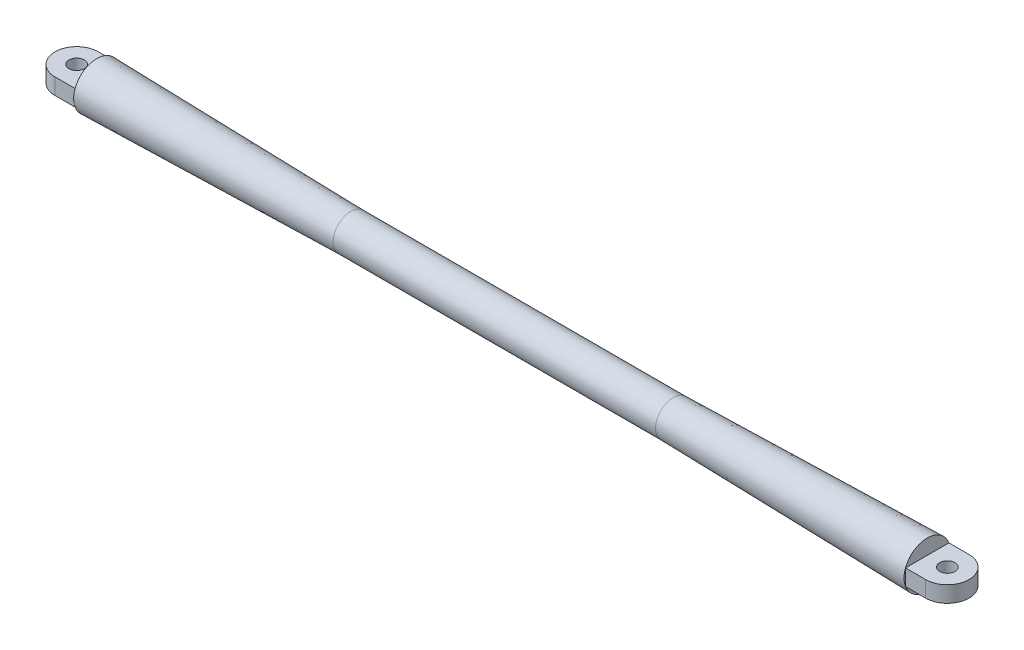
ISO-10303-21;
HEADER;
FILE_DESCRIPTION(('STEP AP214'),'2;1');
FILE_NAME('part.step','',(''),(''),'','','');
FILE_SCHEMA(('AUTOMOTIVE_DESIGN { 1 0 10303 214 1 1 1 1 }'));
ENDSEC;
DATA;
#1=APPLICATION_CONTEXT('core data for automotive mechanical design processes');
#2=APPLICATION_PROTOCOL_DEFINITION('international standard','automotive_design',2000,#1);
#3=PRODUCT_CONTEXT('',#1,'mechanical');
#4=PRODUCT('Part','Part','',(#3));
#5=PRODUCT_RELATED_PRODUCT_CATEGORY('part','',(#4));
#6=PRODUCT_DEFINITION_FORMATION('','',#4);
#7=PRODUCT_DEFINITION_CONTEXT('part definition',#1,'design');
#8=PRODUCT_DEFINITION('design','',#6,#7);
#9=PRODUCT_DEFINITION_SHAPE('','',#8);
#10=(LENGTH_UNIT() NAMED_UNIT(*) SI_UNIT(.MILLI.,.METRE.));
#11=(NAMED_UNIT(*) PLANE_ANGLE_UNIT() SI_UNIT($,.RADIAN.));
#12=(NAMED_UNIT(*) SI_UNIT($,.STERADIAN.) SOLID_ANGLE_UNIT());
#13=UNCERTAINTY_MEASURE_WITH_UNIT(LENGTH_MEASURE(1.E-05),#10,'distance_accuracy_value','');
#14=(GEOMETRIC_REPRESENTATION_CONTEXT(3) GLOBAL_UNCERTAINTY_ASSIGNED_CONTEXT((#13)) GLOBAL_UNIT_ASSIGNED_CONTEXT((#10,
#11,#12)) REPRESENTATION_CONTEXT('',''));
#15=CARTESIAN_POINT('',(0.,0.,0.));
#16=DIRECTION('',(0.,0.,1.));
#17=DIRECTION('',(1.,0.,0.));
#18=AXIS2_PLACEMENT_3D('',#15,#16,#17);
#19=CARTESIAN_POINT('',(575.,0.,0.));
#20=DIRECTION('',(1.,0.,0.));
#21=DIRECTION('',(0.,0.,-1.));
#22=AXIS2_PLACEMENT_3D('',#19,#20,#21);
#23=CONICAL_SURFACE('',#22,30.,0.0213300978711052);
#24=CARTESIAN_POINT('',(200.,0.,0.));
#25=DIRECTION('',(-1.,0.,0.));
#26=DIRECTION('',(0.,0.,1.));
#27=AXIS2_PLACEMENT_3D('',#24,#25,#26);
#28=CIRCLE('',#27,22.);
#29=CARTESIAN_POINT('',(200.,0.,22.));
#30=VERTEX_POINT('',#29);
#31=EDGE_CURVE('E185',#30,#30,#28,.T.);
#32=ORIENTED_EDGE('',*,*,#31,.F.);
#33=EDGE_LOOP('',(#32));
#34=FACE_BOUND('',#33,.T.);
#35=CARTESIAN_POINT('',(515.,0.,0.));
#36=DIRECTION('',(-1.,0.,0.));
#37=DIRECTION('',(0.,-1.,0.));
#38=AXIS2_PLACEMENT_3D('',#35,#36,#37);
#39=CIRCLE('',#38,28.72);
#40=CARTESIAN_POINT('',(515.,10.,26.9228230317699));
#41=VERTEX_POINT('',#40);
#42=CARTESIAN_POINT('',(515.,10.,-26.9228230317699));
#43=VERTEX_POINT('',#42);
#44=EDGE_CURVE('E193',#41,#43,#39,.T.);
#45=ORIENTED_EDGE('',*,*,#44,.T.);
#46=CARTESIAN_POINT('',(515.,0.,0.));
#47=DIRECTION('',(-1.,0.,0.));
#48=DIRECTION('',(0.,-1.,0.));
#49=AXIS2_PLACEMENT_3D('',#46,#47,#48);
#50=CIRCLE('',#49,28.72);
#51=CARTESIAN_POINT('',(515.,-10.,-26.9228230317699));
#52=VERTEX_POINT('',#51);
#53=EDGE_CURVE('E178',#43,#52,#50,.T.);
#54=ORIENTED_EDGE('',*,*,#53,.T.);
#55=CARTESIAN_POINT('',(515.,3.92669099316312E-13,0.));
#56=DIRECTION('',(-1.,0.,0.));
#57=DIRECTION('',(0.,-1.,0.));
#58=AXIS2_PLACEMENT_3D('',#55,#56,#57);
#59=CIRCLE('',#58,28.72);
#60=CARTESIAN_POINT('',(515.,-10.,26.9228230317699));
#61=VERTEX_POINT('',#60);
#62=EDGE_CURVE('E190',#52,#61,#59,.T.);
#63=ORIENTED_EDGE('',*,*,#62,.T.);
#64=CARTESIAN_POINT('',(515.,0.,0.));
#65=DIRECTION('',(-1.,0.,0.));
#66=DIRECTION('',(0.,-1.,0.));
#67=AXIS2_PLACEMENT_3D('',#64,#65,#66);
#68=CIRCLE('',#67,28.72);
#69=EDGE_CURVE('E175',#61,#41,#68,.T.);
#70=ORIENTED_EDGE('',*,*,#69,.T.);
#71=EDGE_LOOP('',(#45,#54,#63,#70));
#72=FACE_BOUND('',#71,.T.);
#73=ADVANCED_FACE('F33',(#34,#72),#23,.T.);
#74=CARTESIAN_POINT('',(0.,0.,0.));
#75=DIRECTION('',(-1.,0.,0.));
#76=DIRECTION('',(0.,0.,1.));
#77=AXIS2_PLACEMENT_3D('',#74,#75,#76);
#78=CYLINDRICAL_SURFACE('',#77,22.);
#79=ORIENTED_EDGE('',*,*,#31,.T.);
#80=EDGE_LOOP('',(#79));
#81=FACE_BOUND('',#80,.T.);
#82=CARTESIAN_POINT('',(-200.,0.,0.));
#83=DIRECTION('',(-1.,0.,0.));
#84=DIRECTION('',(0.,0.,1.));
#85=AXIS2_PLACEMENT_3D('',#82,#83,#84);
#86=CIRCLE('',#85,22.);
#87=CARTESIAN_POINT('',(-200.,0.,22.));
#88=VERTEX_POINT('',#87);
#89=EDGE_CURVE('E136',#88,#88,#86,.T.);
#90=ORIENTED_EDGE('',*,*,#89,.F.);
#91=EDGE_LOOP('',(#90));
#92=FACE_BOUND('',#91,.T.);
#93=ADVANCED_FACE('F231',(#81,#92),#78,.T.);
#94=CARTESIAN_POINT('',(515.,-43.7552756099469,-30.));
#95=DIRECTION('',(-1.,0.,0.));
#96=DIRECTION('',(0.,-1.,0.));
#97=AXIS2_PLACEMENT_3D('',#94,#95,#96);
#98=PLANE('',#97);
#99=DIRECTION('',(0.,0.,1.));
#100=VECTOR('',#99,1.);
#101=CARTESIAN_POINT('',(515.,-10.,-30.));
#102=LINE('',#101,#100);
#103=EDGE_CURVE('E181',#52,#61,#102,.T.);
#104=ORIENTED_EDGE('',*,*,#103,.T.);
#105=ORIENTED_EDGE('',*,*,#62,.F.);
#106=EDGE_LOOP('',(#104,#105));
#107=FACE_BOUND('',#106,.T.);
#108=ADVANCED_FACE('F212',(#107),#98,.F.);
#109=CARTESIAN_POINT('',(515.,-10.,-30.));
#110=DIRECTION('',(0.,1.,0.));
#111=DIRECTION('',(-1.,0.,0.));
#112=AXIS2_PLACEMENT_3D('',#109,#110,#111);
#113=PLANE('',#112);
#114=CARTESIAN_POINT('',(540.,-10.,0.));
#115=DIRECTION('',(0.,1.,0.));
#116=DIRECTION('',(-1.,0.,0.));
#117=AXIS2_PLACEMENT_3D('',#114,#115,#116);
#118=CIRCLE('',#117,9.49999999999995);
#119=CARTESIAN_POINT('',(530.5,-10.,0.));
#120=VERTEX_POINT('',#119);
#121=EDGE_CURVE('E155',#120,#120,#118,.T.);
#122=ORIENTED_EDGE('',*,*,#121,.T.);
#123=EDGE_LOOP('',(#122));
#124=FACE_BOUND('',#123,.T.);
#125=CARTESIAN_POINT('',(540.,-10.,0.));
#126=DIRECTION('',(0.,1.,0.));
#127=DIRECTION('',(-1.,0.,0.));
#128=AXIS2_PLACEMENT_3D('',#125,#126,#127);
#129=CIRCLE('',#128,26.9228230317699);
#130=CARTESIAN_POINT('',(540.,-10.,-26.9228230317699));
#131=VERTEX_POINT('',#130);
#132=CARTESIAN_POINT('',(540.,-10.,26.9228230317699));
#133=VERTEX_POINT('',#132);
#134=EDGE_CURVE('E169',#131,#133,#129,.F.);
#135=ORIENTED_EDGE('',*,*,#134,.T.);
#136=DIRECTION('',(-1.,0.,0.));
#137=VECTOR('',#136,1.);
#138=CARTESIAN_POINT('',(515.,-10.,26.9228230317699));
#139=LINE('',#138,#137);
#140=EDGE_CURVE('E172',#133,#61,#139,.T.);
#141=ORIENTED_EDGE('',*,*,#140,.T.);
#142=ORIENTED_EDGE('',*,*,#103,.F.);
#143=DIRECTION('',(1.,0.,0.));
#144=VECTOR('',#143,1.);
#145=CARTESIAN_POINT('',(515.,-10.,-26.9228230317699));
#146=LINE('',#145,#144);
#147=EDGE_CURVE('E160',#52,#131,#146,.T.);
#148=ORIENTED_EDGE('',*,*,#147,.T.);
#149=EDGE_LOOP('',(#135,#141,#142,#148));
#150=FACE_BOUND('',#149,.T.);
#151=ADVANCED_FACE('F209',(#124,#150),#113,.F.);
#152=CARTESIAN_POINT('',(515.,43.7552756099469,-30.));
#153=DIRECTION('',(-1.,0.,0.));
#154=DIRECTION('',(0.,-1.,0.));
#155=AXIS2_PLACEMENT_3D('',#152,#153,#154);
#156=PLANE('',#155);
#157=DIRECTION('',(0.,0.,1.));
#158=VECTOR('',#157,1.);
#159=CARTESIAN_POINT('',(515.,10.,-30.));
#160=LINE('',#159,#158);
#161=EDGE_CURVE('E182',#43,#41,#160,.T.);
#162=ORIENTED_EDGE('',*,*,#161,.F.);
#163=ORIENTED_EDGE('',*,*,#44,.F.);
#164=EDGE_LOOP('',(#162,#163));
#165=FACE_BOUND('',#164,.T.);
#166=ADVANCED_FACE('F226',(#165),#156,.F.);
#167=CARTESIAN_POINT('',(515.,10.,-30.));
#168=DIRECTION('',(0.,-1.,0.));
#169=DIRECTION('',(1.,0.,0.));
#170=AXIS2_PLACEMENT_3D('',#167,#168,#169);
#171=PLANE('',#170);
#172=CARTESIAN_POINT('',(540.,10.,0.));
#173=DIRECTION('',(0.,1.,0.));
#174=DIRECTION('',(-1.,0.,0.));
#175=AXIS2_PLACEMENT_3D('',#172,#173,#174);
#176=CIRCLE('',#175,9.49999999999995);
#177=CARTESIAN_POINT('',(530.5,10.,0.));
#178=VERTEX_POINT('',#177);
#179=EDGE_CURVE('E152',#178,#178,#176,.T.);
#180=ORIENTED_EDGE('',*,*,#179,.F.);
#181=EDGE_LOOP('',(#180));
#182=FACE_BOUND('',#181,.T.);
#183=ORIENTED_EDGE('',*,*,#161,.T.);
#184=DIRECTION('',(1.,0.,0.));
#185=VECTOR('',#184,1.);
#186=CARTESIAN_POINT('',(515.,10.,26.9228230317699));
#187=LINE('',#186,#185);
#188=CARTESIAN_POINT('',(540.,10.,26.9228230317699));
#189=VERTEX_POINT('',#188);
#190=EDGE_CURVE('E11',#41,#189,#187,.T.);
#191=ORIENTED_EDGE('',*,*,#190,.T.);
#192=CARTESIAN_POINT('',(540.,10.,0.));
#193=DIRECTION('',(0.,-1.,0.));
#194=DIRECTION('',(1.,0.,0.));
#195=AXIS2_PLACEMENT_3D('',#192,#193,#194);
#196=CIRCLE('',#195,26.9228230317699);
#197=CARTESIAN_POINT('',(540.,10.,-26.9228230317699));
#198=VERTEX_POINT('',#197);
#199=EDGE_CURVE('E40',#189,#198,#196,.F.);
#200=ORIENTED_EDGE('',*,*,#199,.T.);
#201=DIRECTION('',(-1.,0.,0.));
#202=VECTOR('',#201,1.);
#203=CARTESIAN_POINT('',(515.,10.,-26.9228230317699));
#204=LINE('',#203,#202);
#205=EDGE_CURVE('E196',#198,#43,#204,.T.);
#206=ORIENTED_EDGE('',*,*,#205,.T.);
#207=EDGE_LOOP('',(#183,#191,#200,#206));
#208=FACE_BOUND('',#207,.T.);
#209=ADVANCED_FACE('F200',(#182,#208),#171,.F.);
#210=CARTESIAN_POINT('',(515.,-28.7199999999996,-26.9228230317699));
#211=DIRECTION('',(-1.,0.,0.));
#212=DIRECTION('',(0.,-1.,0.));
#213=AXIS2_PLACEMENT_3D('',#210,#211,#212);
#214=PLANE('',#213);
#215=DIRECTION('',(0.,1.,0.));
#216=VECTOR('',#215,1.);
#217=CARTESIAN_POINT('',(515.,-28.7199999999996,-26.9228230317699));
#218=LINE('',#217,#216);
#219=EDGE_CURVE('E47',#52,#43,#218,.T.);
#220=ORIENTED_EDGE('',*,*,#219,.F.);
#221=ORIENTED_EDGE('',*,*,#53,.F.);
#222=EDGE_LOOP('',(#220,#221));
#223=FACE_BOUND('',#222,.T.);
#224=ADVANCED_FACE('F216',(#223),#214,.F.);
#225=CARTESIAN_POINT('',(515.,-28.7199999999996,47.4225049257848));
#226=DIRECTION('',(-1.,0.,0.));
#227=DIRECTION('',(0.,-1.,0.));
#228=AXIS2_PLACEMENT_3D('',#225,#226,#227);
#229=PLANE('',#228);
#230=DIRECTION('',(0.,1.,0.));
#231=VECTOR('',#230,1.);
#232=CARTESIAN_POINT('',(515.,-28.7199999999996,26.9228230317699));
#233=LINE('',#232,#231);
#234=EDGE_CURVE('E158',#61,#41,#233,.T.);
#235=ORIENTED_EDGE('',*,*,#234,.T.);
#236=ORIENTED_EDGE('',*,*,#69,.F.);
#237=EDGE_LOOP('',(#235,#236));
#238=FACE_BOUND('',#237,.T.);
#239=ADVANCED_FACE('F218',(#238),#229,.F.);
#240=CARTESIAN_POINT('',(540.,-28.7199999999996,26.9228230317699));
#241=DIRECTION('',(0.,0.,-1.));
#242=DIRECTION('',(-1.,0.,0.));
#243=AXIS2_PLACEMENT_3D('',#240,#241,#242);
#244=PLANE('',#243);
#245=DIRECTION('',(0.,1.,0.));
#246=VECTOR('',#245,1.);
#247=CARTESIAN_POINT('',(540.,-28.7199999999996,26.9228230317699));
#248=LINE('',#247,#246);
#249=EDGE_CURVE('E161',#133,#189,#248,.T.);
#250=ORIENTED_EDGE('',*,*,#249,.T.);
#251=ORIENTED_EDGE('',*,*,#190,.F.);
#252=ORIENTED_EDGE('',*,*,#234,.F.);
#253=ORIENTED_EDGE('',*,*,#140,.F.);
#254=EDGE_LOOP('',(#250,#251,#252,#253));
#255=FACE_BOUND('',#254,.T.);
#256=ADVANCED_FACE('F206',(#255),#244,.F.);
#257=CARTESIAN_POINT('',(540.,-28.7199999999996,0.));
#258=DIRECTION('',(0.,1.,0.));
#259=DIRECTION('',(-1.,0.,0.));
#260=AXIS2_PLACEMENT_3D('',#257,#258,#259);
#261=CYLINDRICAL_SURFACE('',#260,26.9228230317699);
#262=DIRECTION('',(0.,1.,0.));
#263=VECTOR('',#262,1.);
#264=CARTESIAN_POINT('',(540.,-28.7199999999996,-26.9228230317699));
#265=LINE('',#264,#263);
#266=EDGE_CURVE('E163',#131,#198,#265,.T.);
#267=ORIENTED_EDGE('',*,*,#266,.T.);
#268=ORIENTED_EDGE('',*,*,#199,.F.);
#269=ORIENTED_EDGE('',*,*,#249,.F.);
#270=ORIENTED_EDGE('',*,*,#134,.F.);
#271=EDGE_LOOP('',(#267,#268,#269,#270));
#272=FACE_BOUND('',#271,.T.);
#273=ADVANCED_FACE('F204',(#272),#261,.T.);
#274=CARTESIAN_POINT('',(515.,-28.7199999999996,-26.9228230317699));
#275=DIRECTION('',(0.,0.,1.));
#276=DIRECTION('',(1.,0.,0.));
#277=AXIS2_PLACEMENT_3D('',#274,#275,#276);
#278=PLANE('',#277);
#279=ORIENTED_EDGE('',*,*,#219,.T.);
#280=ORIENTED_EDGE('',*,*,#205,.F.);
#281=ORIENTED_EDGE('',*,*,#266,.F.);
#282=ORIENTED_EDGE('',*,*,#147,.F.);
#283=EDGE_LOOP('',(#279,#280,#281,#282));
#284=FACE_BOUND('',#283,.T.);
#285=ADVANCED_FACE('F273',(#284),#278,.F.);
#286=CARTESIAN_POINT('',(540.,-28.7199999999996,0.));
#287=DIRECTION('',(0.,1.,0.));
#288=DIRECTION('',(-1.,0.,0.));
#289=AXIS2_PLACEMENT_3D('',#286,#287,#288);
#290=CYLINDRICAL_SURFACE('',#289,9.49999999999995);
#291=ORIENTED_EDGE('',*,*,#179,.T.);
#292=EDGE_LOOP('',(#291));
#293=FACE_BOUND('',#292,.T.);
#294=ORIENTED_EDGE('',*,*,#121,.F.);
#295=EDGE_LOOP('',(#294));
#296=FACE_BOUND('',#295,.T.);
#297=ADVANCED_FACE('F245',(#293,#296),#290,.F.);
#298=CARTESIAN_POINT('',(-575.,0.,0.));
#299=DIRECTION('',(-1.,0.,0.));
#300=DIRECTION('',(0.,0.,-1.));
#301=AXIS2_PLACEMENT_3D('',#298,#299,#300);
#302=CONICAL_SURFACE('',#301,30.,0.0213300978711052);
#303=ORIENTED_EDGE('',*,*,#89,.T.);
#304=EDGE_LOOP('',(#303));
#305=FACE_BOUND('',#304,.T.);
#306=CARTESIAN_POINT('',(-515.,0.,0.));
#307=DIRECTION('',(-1.,0.,0.));
#308=DIRECTION('',(0.,-1.,0.));
#309=AXIS2_PLACEMENT_3D('',#306,#307,#308);
#310=CIRCLE('',#309,28.72);
#311=CARTESIAN_POINT('',(-515.,10.,26.9228230317699));
#312=VERTEX_POINT('',#311);
#313=CARTESIAN_POINT('',(-515.,10.,-26.9228230317699));
#314=VERTEX_POINT('',#313);
#315=EDGE_CURVE('E143',#312,#314,#310,.T.);
#316=ORIENTED_EDGE('',*,*,#315,.F.);
#317=CARTESIAN_POINT('',(-515.,0.,0.));
#318=DIRECTION('',(-1.,0.,0.));
#319=DIRECTION('',(0.,-1.,0.));
#320=AXIS2_PLACEMENT_3D('',#317,#318,#319);
#321=CIRCLE('',#320,28.72);
#322=CARTESIAN_POINT('',(-515.,-10.,26.9228230317699));
#323=VERTEX_POINT('',#322);
#324=EDGE_CURVE('E123',#323,#312,#321,.T.);
#325=ORIENTED_EDGE('',*,*,#324,.F.);
#326=CARTESIAN_POINT('',(-515.,3.92669099316312E-13,0.));
#327=DIRECTION('',(-1.,0.,0.));
#328=DIRECTION('',(0.,-1.,0.));
#329=AXIS2_PLACEMENT_3D('',#326,#327,#328);
#330=CIRCLE('',#329,28.72);
#331=CARTESIAN_POINT('',(-515.,-10.,-26.9228230317699));
#332=VERTEX_POINT('',#331);
#333=EDGE_CURVE('E140',#332,#323,#330,.T.);
#334=ORIENTED_EDGE('',*,*,#333,.F.);
#335=CARTESIAN_POINT('',(-515.,0.,0.));
#336=DIRECTION('',(-1.,0.,0.));
#337=DIRECTION('',(0.,-1.,0.));
#338=AXIS2_PLACEMENT_3D('',#335,#336,#337);
#339=CIRCLE('',#338,28.72);
#340=EDGE_CURVE('E129',#314,#332,#339,.T.);
#341=ORIENTED_EDGE('',*,*,#340,.F.);
#342=EDGE_LOOP('',(#316,#325,#334,#341));
#343=FACE_BOUND('',#342,.T.);
#344=ADVANCED_FACE('F241',(#305,#343),#302,.T.);
#345=CARTESIAN_POINT('',(-515.,-43.7552756099469,-30.));
#346=DIRECTION('',(1.,0.,0.));
#347=DIRECTION('',(0.,-1.,0.));
#348=AXIS2_PLACEMENT_3D('',#345,#346,#347);
#349=PLANE('',#348);
#350=DIRECTION('',(0.,0.,1.));
#351=VECTOR('',#350,1.);
#352=CARTESIAN_POINT('',(-515.,-10.,-30.));
#353=LINE('',#352,#351);
#354=EDGE_CURVE('E132',#332,#323,#353,.T.);
#355=ORIENTED_EDGE('',*,*,#354,.F.);
#356=ORIENTED_EDGE('',*,*,#333,.T.);
#357=EDGE_LOOP('',(#355,#356));
#358=FACE_BOUND('',#357,.T.);
#359=ADVANCED_FACE('F244',(#358),#349,.F.);
#360=CARTESIAN_POINT('',(-515.,-10.,-30.));
#361=DIRECTION('',(0.,1.,0.));
#362=DIRECTION('',(1.,0.,0.));
#363=AXIS2_PLACEMENT_3D('',#360,#361,#362);
#364=PLANE('',#363);
#365=CARTESIAN_POINT('',(-540.,-10.,0.));
#366=DIRECTION('',(0.,-1.,0.));
#367=DIRECTION('',(1.,0.,0.));
#368=AXIS2_PLACEMENT_3D('',#365,#366,#367);
#369=CIRCLE('',#368,9.49999999999995);
#370=CARTESIAN_POINT('',(-530.5,-10.,0.));
#371=VERTEX_POINT('',#370);
#372=EDGE_CURVE('E388',#371,#371,#369,.T.);
#373=ORIENTED_EDGE('',*,*,#372,.F.);
#374=EDGE_LOOP('',(#373));
#375=FACE_BOUND('',#374,.T.);
#376=CARTESIAN_POINT('',(-540.,-10.,0.));
#377=DIRECTION('',(0.,-1.,0.));
#378=DIRECTION('',(1.,0.,0.));
#379=AXIS2_PLACEMENT_3D('',#376,#377,#378);
#380=CIRCLE('',#379,26.9228230317699);
#381=CARTESIAN_POINT('',(-540.,-10.,-26.9228230317699));
#382=VERTEX_POINT('',#381);
#383=CARTESIAN_POINT('',(-540.,-10.,26.9228230317699));
#384=VERTEX_POINT('',#383);
#385=EDGE_CURVE('E101',#382,#384,#380,.F.);
#386=ORIENTED_EDGE('',*,*,#385,.F.);
#387=DIRECTION('',(-1.,0.,0.));
#388=VECTOR('',#387,1.);
#389=CARTESIAN_POINT('',(-515.,-10.,-26.9228230317699));
#390=LINE('',#389,#388);
#391=EDGE_CURVE('E111',#332,#382,#390,.T.);
#392=ORIENTED_EDGE('',*,*,#391,.F.);
#393=ORIENTED_EDGE('',*,*,#354,.T.);
#394=DIRECTION('',(1.,0.,0.));
#395=VECTOR('',#394,1.);
#396=CARTESIAN_POINT('',(-515.,-10.,26.9228230317699));
#397=LINE('',#396,#395);
#398=EDGE_CURVE('E121',#384,#323,#397,.T.);
#399=ORIENTED_EDGE('',*,*,#398,.F.);
#400=EDGE_LOOP('',(#386,#392,#393,#399));
#401=FACE_BOUND('',#400,.T.);
#402=ADVANCED_FACE('F119',(#375,#401),#364,.F.);
#403=CARTESIAN_POINT('',(-515.,43.7552756099469,-30.));
#404=DIRECTION('',(1.,0.,0.));
#405=DIRECTION('',(0.,-1.,0.));
#406=AXIS2_PLACEMENT_3D('',#403,#404,#405);
#407=PLANE('',#406);
#408=DIRECTION('',(0.,0.,1.));
#409=VECTOR('',#408,1.);
#410=CARTESIAN_POINT('',(-515.,10.,-30.));
#411=LINE('',#410,#409);
#412=EDGE_CURVE('E133',#314,#312,#411,.T.);
#413=ORIENTED_EDGE('',*,*,#412,.T.);
#414=ORIENTED_EDGE('',*,*,#315,.T.);
#415=EDGE_LOOP('',(#413,#414));
#416=FACE_BOUND('',#415,.T.);
#417=ADVANCED_FACE('F252',(#416),#407,.F.);
#418=CARTESIAN_POINT('',(-515.,10.,-30.));
#419=DIRECTION('',(0.,-1.,0.));
#420=DIRECTION('',(-1.,0.,0.));
#421=AXIS2_PLACEMENT_3D('',#418,#419,#420);
#422=PLANE('',#421);
#423=CARTESIAN_POINT('',(-540.,10.,0.));
#424=DIRECTION('',(0.,-1.,0.));
#425=DIRECTION('',(1.,0.,0.));
#426=AXIS2_PLACEMENT_3D('',#423,#424,#425);
#427=CIRCLE('',#426,9.49999999999995);
#428=CARTESIAN_POINT('',(-530.5,10.,0.));
#429=VERTEX_POINT('',#428);
#430=EDGE_CURVE('E385',#429,#429,#427,.T.);
#431=ORIENTED_EDGE('',*,*,#430,.T.);
#432=EDGE_LOOP('',(#431));
#433=FACE_BOUND('',#432,.T.);
#434=ORIENTED_EDGE('',*,*,#412,.F.);
#435=DIRECTION('',(1.,0.,0.));
#436=VECTOR('',#435,1.);
#437=CARTESIAN_POINT('',(-515.,10.,-26.9228230317699));
#438=LINE('',#437,#436);
#439=CARTESIAN_POINT('',(-540.,10.,-26.9228230317699));
#440=VERTEX_POINT('',#439);
#441=EDGE_CURVE('E146',#440,#314,#438,.T.);
#442=ORIENTED_EDGE('',*,*,#441,.F.);
#443=CARTESIAN_POINT('',(-540.,10.,0.));
#444=DIRECTION('',(0.,1.,0.));
#445=DIRECTION('',(-1.,0.,0.));
#446=AXIS2_PLACEMENT_3D('',#443,#444,#445);
#447=CIRCLE('',#446,26.9228230317699);
#448=CARTESIAN_POINT('',(-540.,10.,26.9228230317699));
#449=VERTEX_POINT('',#448);
#450=EDGE_CURVE('E103',#449,#440,#447,.F.);
#451=ORIENTED_EDGE('',*,*,#450,.F.);
#452=DIRECTION('',(-1.,0.,0.));
#453=VECTOR('',#452,1.);
#454=CARTESIAN_POINT('',(-515.,10.,26.9228230317699));
#455=LINE('',#454,#453);
#456=EDGE_CURVE('E149',#312,#449,#455,.T.);
#457=ORIENTED_EDGE('',*,*,#456,.F.);
#458=EDGE_LOOP('',(#434,#442,#451,#457));
#459=FACE_BOUND('',#458,.T.);
#460=ADVANCED_FACE('F319',(#433,#459),#422,.F.);
#461=CARTESIAN_POINT('',(-515.,-28.7199999999996,-26.9228230317699));
#462=DIRECTION('',(1.,0.,0.));
#463=DIRECTION('',(0.,-1.,0.));
#464=AXIS2_PLACEMENT_3D('',#461,#462,#463);
#465=PLANE('',#464);
#466=DIRECTION('',(0.,1.,0.));
#467=VECTOR('',#466,1.);
#468=CARTESIAN_POINT('',(-515.,-28.7199999999996,-26.9228230317699));
#469=LINE('',#468,#467);
#470=EDGE_CURVE('E108',#332,#314,#469,.T.);
#471=ORIENTED_EDGE('',*,*,#470,.T.);
#472=ORIENTED_EDGE('',*,*,#340,.T.);
#473=EDGE_LOOP('',(#471,#472));
#474=FACE_BOUND('',#473,.T.);
#475=ADVANCED_FACE('F327',(#474),#465,.F.);
#476=CARTESIAN_POINT('',(-515.,-28.7199999999996,47.4225049257848));
#477=DIRECTION('',(1.,0.,0.));
#478=DIRECTION('',(0.,-1.,0.));
#479=AXIS2_PLACEMENT_3D('',#476,#477,#478);
#480=PLANE('',#479);
#481=DIRECTION('',(0.,1.,0.));
#482=VECTOR('',#481,1.);
#483=CARTESIAN_POINT('',(-515.,-28.7199999999996,26.9228230317699));
#484=LINE('',#483,#482);
#485=EDGE_CURVE('E116',#323,#312,#484,.T.);
#486=ORIENTED_EDGE('',*,*,#485,.F.);
#487=ORIENTED_EDGE('',*,*,#324,.T.);
#488=EDGE_LOOP('',(#486,#487));
#489=FACE_BOUND('',#488,.T.);
#490=ADVANCED_FACE('F257',(#489),#480,.F.);
#491=CARTESIAN_POINT('',(-540.,-28.7199999999996,26.9228230317699));
#492=DIRECTION('',(0.,0.,-1.));
#493=DIRECTION('',(1.,0.,0.));
#494=AXIS2_PLACEMENT_3D('',#491,#492,#493);
#495=PLANE('',#494);
#496=DIRECTION('',(0.,1.,0.));
#497=VECTOR('',#496,1.);
#498=CARTESIAN_POINT('',(-540.,-28.7199999999996,26.9228230317699));
#499=LINE('',#498,#497);
#500=EDGE_CURVE('E107',#384,#449,#499,.T.);
#501=ORIENTED_EDGE('',*,*,#500,.F.);
#502=ORIENTED_EDGE('',*,*,#398,.T.);
#503=ORIENTED_EDGE('',*,*,#485,.T.);
#504=ORIENTED_EDGE('',*,*,#456,.T.);
#505=EDGE_LOOP('',(#501,#502,#503,#504));
#506=FACE_BOUND('',#505,.T.);
#507=ADVANCED_FACE('F260',(#506),#495,.F.);
#508=CARTESIAN_POINT('',(-540.,-28.7199999999996,0.));
#509=DIRECTION('',(0.,1.,0.));
#510=DIRECTION('',(1.,0.,0.));
#511=AXIS2_PLACEMENT_3D('',#508,#509,#510);
#512=CYLINDRICAL_SURFACE('',#511,26.9228230317699);
#513=DIRECTION('',(0.,1.,0.));
#514=VECTOR('',#513,1.);
#515=CARTESIAN_POINT('',(-540.,-28.7199999999996,-26.9228230317699));
#516=LINE('',#515,#514);
#517=EDGE_CURVE('E97',#382,#440,#516,.T.);
#518=ORIENTED_EDGE('',*,*,#517,.F.);
#519=ORIENTED_EDGE('',*,*,#385,.T.);
#520=ORIENTED_EDGE('',*,*,#500,.T.);
#521=ORIENTED_EDGE('',*,*,#450,.T.);
#522=EDGE_LOOP('',(#518,#519,#520,#521));
#523=FACE_BOUND('',#522,.T.);
#524=ADVANCED_FACE('F99',(#523),#512,.T.);
#525=CARTESIAN_POINT('',(-515.,-28.7199999999996,-26.9228230317699));
#526=DIRECTION('',(0.,0.,1.));
#527=DIRECTION('',(-1.,0.,0.));
#528=AXIS2_PLACEMENT_3D('',#525,#526,#527);
#529=PLANE('',#528);
#530=ORIENTED_EDGE('',*,*,#470,.F.);
#531=ORIENTED_EDGE('',*,*,#391,.T.);
#532=ORIENTED_EDGE('',*,*,#517,.T.);
#533=ORIENTED_EDGE('',*,*,#441,.T.);
#534=EDGE_LOOP('',(#530,#531,#532,#533));
#535=FACE_BOUND('',#534,.T.);
#536=ADVANCED_FACE('F112',(#535),#529,.F.);
#537=CARTESIAN_POINT('',(-540.,-28.7199999999996,0.));
#538=DIRECTION('',(0.,1.,0.));
#539=DIRECTION('',(1.,0.,0.));
#540=AXIS2_PLACEMENT_3D('',#537,#538,#539);
#541=CYLINDRICAL_SURFACE('',#540,9.49999999999995);
#542=ORIENTED_EDGE('',*,*,#430,.F.);
#543=EDGE_LOOP('',(#542));
#544=FACE_BOUND('',#543,.T.);
#545=ORIENTED_EDGE('',*,*,#372,.T.);
#546=EDGE_LOOP('',(#545));
#547=FACE_BOUND('',#546,.T.);
#548=ADVANCED_FACE('F369',(#544,#547),#541,.F.);
#549=CLOSED_SHELL('',(#73,#93,#108,#151,#166,#209,#224,#239,#256,#273,#285,#297,#344,#359,#402,
#417,#460,#475,#490,#507,#524,#536,#548));
#550=MANIFOLD_SOLID_BREP('B2',#549);
#551=ADVANCED_BREP_SHAPE_REPRESENTATION('',(#18,#550),#14);
#552=SHAPE_DEFINITION_REPRESENTATION(#9,#551);
ENDSEC;
END-ISO-10303-21;
